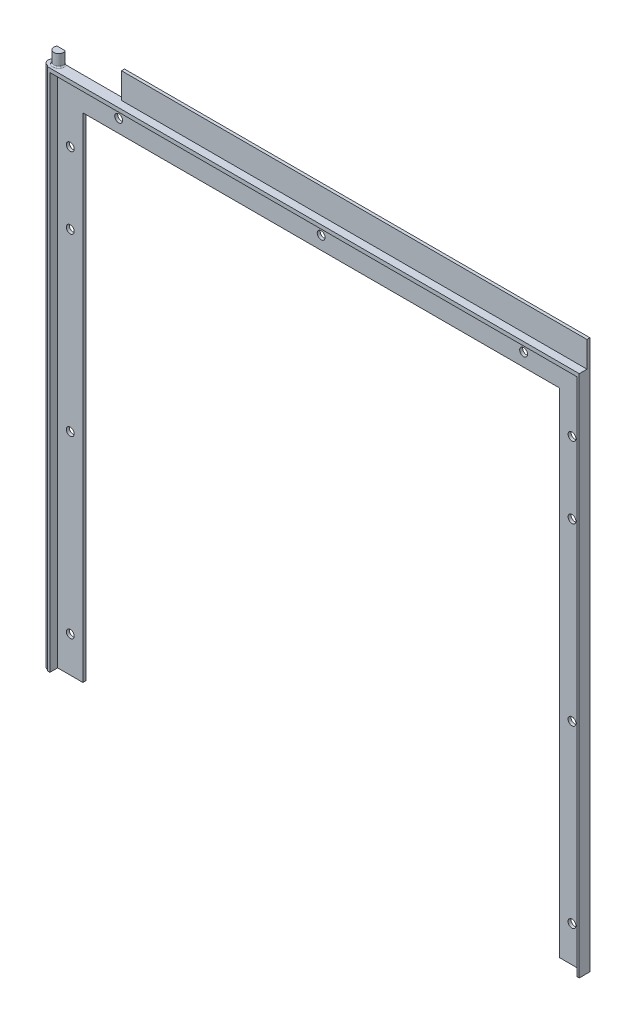
ISO-10303-21;
HEADER;
FILE_DESCRIPTION(('STEP AP214'),'2;1');
FILE_NAME('part.step','',(''),(''),'','','');
FILE_SCHEMA(('AUTOMOTIVE_DESIGN { 1 0 10303 214 1 1 1 1 }'));
ENDSEC;
DATA;
#1=APPLICATION_CONTEXT('core data for automotive mechanical design processes');
#2=APPLICATION_PROTOCOL_DEFINITION('international standard','automotive_design',2000,#1);
#3=PRODUCT_CONTEXT('',#1,'mechanical');
#4=PRODUCT('Part','Part','',(#3));
#5=PRODUCT_RELATED_PRODUCT_CATEGORY('part','',(#4));
#6=PRODUCT_DEFINITION_FORMATION('','',#4);
#7=PRODUCT_DEFINITION_CONTEXT('part definition',#1,'design');
#8=PRODUCT_DEFINITION('design','',#6,#7);
#9=PRODUCT_DEFINITION_SHAPE('','',#8);
#10=(LENGTH_UNIT() NAMED_UNIT(*) SI_UNIT(.MILLI.,.METRE.));
#11=(NAMED_UNIT(*) PLANE_ANGLE_UNIT() SI_UNIT($,.RADIAN.));
#12=(NAMED_UNIT(*) SI_UNIT($,.STERADIAN.) SOLID_ANGLE_UNIT());
#13=UNCERTAINTY_MEASURE_WITH_UNIT(LENGTH_MEASURE(1.E-05),#10,'distance_accuracy_value','');
#14=(GEOMETRIC_REPRESENTATION_CONTEXT(3) GLOBAL_UNCERTAINTY_ASSIGNED_CONTEXT((#13)) GLOBAL_UNIT_ASSIGNED_CONTEXT((#10,
#11,#12)) REPRESENTATION_CONTEXT('',''));
#15=CARTESIAN_POINT('',(0.,0.,0.));
#16=DIRECTION('',(0.,0.,1.));
#17=DIRECTION('',(1.,0.,0.));
#18=AXIS2_PLACEMENT_3D('',#15,#16,#17);
#19=CARTESIAN_POINT('',(92.3497974872589,279.450982809067,1.25));
#20=DIRECTION('',(0.,-1.,0.));
#21=DIRECTION('',(0.,0.,-1.));
#22=AXIS2_PLACEMENT_3D('',#19,#20,#21);
#23=PLANE('',#22);
#24=DIRECTION('',(-1.,0.,0.));
#25=VECTOR('',#24,1.);
#26=CARTESIAN_POINT('',(92.3497974872589,279.450982809067,0.));
#27=LINE('',#26,#25);
#28=CARTESIAN_POINT('',(92.3497974872589,279.450982809067,0.));
#29=VERTEX_POINT('',#28);
#30=CARTESIAN_POINT('',(68.0337396467907,279.450982809067,0.));
#31=VERTEX_POINT('',#30);
#32=EDGE_CURVE('E303',#29,#31,#27,.T.);
#33=ORIENTED_EDGE('',*,*,#32,.T.);
#34=CARTESIAN_POINT('',(65.7508447313991,279.450982809067,1.01901462466386));
#35=DIRECTION('',(0.,-1.,0.));
#36=DIRECTION('',(0.,0.,-1.));
#37=AXIS2_PLACEMENT_3D('',#34,#35,#36);
#38=CIRCLE('',#37,2.49999999999999);
#39=CARTESIAN_POINT('',(63.3919678208426,279.450982809067,0.190944747875881));
#40=VERTEX_POINT('',#39);
#41=EDGE_CURVE('E385',#31,#40,#38,.T.);
#42=ORIENTED_EDGE('',*,*,#41,.T.);
#43=CARTESIAN_POINT('',(64.2486485862909,279.450982809067,1.99631338144911));
#44=DIRECTION('',(0.,1.,0.));
#45=DIRECTION('',(0.,0.,1.));
#46=AXIS2_PLACEMENT_3D('',#43,#44,#45);
#47=CIRCLE('',#46,1.99831374838364);
#48=CARTESIAN_POINT('',(64.2031414601707,279.450982809067,3.99410890112859));
#49=VERTEX_POINT('',#48);
#50=EDGE_CURVE('E205',#40,#49,#47,.T.);
#51=ORIENTED_EDGE('',*,*,#50,.T.);
#52=DIRECTION('',(0.422618261740709,0.,0.906307787036646));
#53=VECTOR('',#52,1.);
#54=CARTESIAN_POINT('',(64.2031414601707,279.450982809067,3.99410890112859));
#55=LINE('',#54,#53);
#56=CARTESIAN_POINT('',(64.4390423537669,279.450982809067,4.5));
#57=VERTEX_POINT('',#56);
#58=EDGE_CURVE('E218',#49,#57,#55,.T.);
#59=ORIENTED_EDGE('',*,*,#58,.T.);
#60=DIRECTION('',(-1.,0.,0.));
#61=VECTOR('',#60,1.);
#62=CARTESIAN_POINT('',(92.3497974872589,279.450982809067,4.5));
#63=LINE('',#62,#61);
#64=CARTESIAN_POINT('',(287.750005722046,279.450982809067,4.5));
#65=VERTEX_POINT('',#64);
#66=EDGE_CURVE('E261',#65,#57,#63,.T.);
#67=ORIENTED_EDGE('',*,*,#66,.F.);
#68=DIRECTION('',(0.,0.,-1.));
#69=VECTOR('',#68,1.);
#70=CARTESIAN_POINT('',(287.750005722046,279.450982809067,4.5));
#71=LINE('',#70,#69);
#72=CARTESIAN_POINT('',(287.750005722046,279.450982809067,1.25));
#73=VERTEX_POINT('',#72);
#74=EDGE_CURVE('E264',#65,#73,#71,.T.);
#75=ORIENTED_EDGE('',*,*,#74,.T.);
#76=DIRECTION('',(-1.,0.,0.));
#77=VECTOR('',#76,1.);
#78=CARTESIAN_POINT('',(92.3497974872589,279.450982809067,1.25));
#79=LINE('',#78,#77);
#80=CARTESIAN_POINT('',(92.3497974872589,279.450982809067,1.25));
#81=VERTEX_POINT('',#80);
#82=EDGE_CURVE('E245',#73,#81,#79,.T.);
#83=ORIENTED_EDGE('',*,*,#82,.T.);
#84=DIRECTION('',(0.,0.,-1.));
#85=VECTOR('',#84,1.);
#86=CARTESIAN_POINT('',(92.3497974872589,279.450982809067,1.25));
#87=LINE('',#86,#85);
#88=EDGE_CURVE('E324',#81,#29,#87,.T.);
#89=ORIENTED_EDGE('',*,*,#88,.T.);
#90=EDGE_LOOP('',(#33,#42,#51,#59,#67,#75,#83,#89));
#91=FACE_BOUND('',#90,.T.);
#92=ADVANCED_FACE('F43',(#91),#23,.F.);
#93=CARTESIAN_POINT('',(0.,0.,1.25));
#94=DIRECTION('',(0.,0.,1.));
#95=DIRECTION('',(1.,0.,0.));
#96=AXIS2_PLACEMENT_3D('',#93,#94,#95);
#97=PLANE('',#96);
#98=ORIENTED_EDGE('',*,*,#82,.F.);
#99=DIRECTION('',(0.,1.,0.));
#100=VECTOR('',#99,1.);
#101=CARTESIAN_POINT('',(287.750005722046,59.7510002553463,1.25));
#102=LINE('',#101,#100);
#103=CARTESIAN_POINT('',(287.750005722046,290.251016616821,1.25));
#104=VERTEX_POINT('',#103);
#105=EDGE_CURVE('E315',#73,#104,#102,.T.);
#106=ORIENTED_EDGE('',*,*,#105,.T.);
#107=DIRECTION('',(-1.,0.,0.));
#108=VECTOR('',#107,1.);
#109=CARTESIAN_POINT('',(287.750005722046,290.251016616821,1.25));
#110=LINE('',#109,#108);
#111=CARTESIAN_POINT('',(92.3497974872589,290.251016616821,1.25));
#112=VERTEX_POINT('',#111);
#113=EDGE_CURVE('E318',#104,#112,#110,.T.);
#114=ORIENTED_EDGE('',*,*,#113,.T.);
#115=DIRECTION('',(0.,-1.,0.));
#116=VECTOR('',#115,1.);
#117=CARTESIAN_POINT('',(92.3497974872589,290.251016616821,1.25));
#118=LINE('',#117,#116);
#119=EDGE_CURVE('E321',#112,#81,#118,.T.);
#120=ORIENTED_EDGE('',*,*,#119,.T.);
#121=EDGE_LOOP('',(#98,#106,#114,#120));
#122=FACE_BOUND('',#121,.T.);
#123=ADVANCED_FACE('F410',(#122),#97,.T.);
#124=CARTESIAN_POINT('',(64.4390423537669,59.7510002553463,1.25));
#125=DIRECTION('',(0.,1.,0.));
#126=DIRECTION('',(0.,0.,1.));
#127=AXIS2_PLACEMENT_3D('',#124,#125,#126);
#128=PLANE('',#127);
#129=DIRECTION('',(0.,0.,-1.));
#130=VECTOR('',#129,1.);
#131=CARTESIAN_POINT('',(65.5498809996054,59.7510002553463,4.5));
#132=LINE('',#131,#130);
#133=CARTESIAN_POINT('',(65.5498809996054,59.7510002553463,4.5));
#134=VERTEX_POINT('',#133);
#135=CARTESIAN_POINT('',(65.5498809996054,59.7510002553463,1.25));
#136=VERTEX_POINT('',#135);
#137=EDGE_CURVE('E294',#134,#136,#132,.T.);
#138=ORIENTED_EDGE('',*,*,#137,.F.);
#139=DIRECTION('',(1.,0.,0.));
#140=VECTOR('',#139,1.);
#141=CARTESIAN_POINT('',(65.5498809996054,59.7510002553463,4.5));
#142=LINE('',#141,#140);
#143=CARTESIAN_POINT('',(64.4390423537669,59.7510002553463,4.5));
#144=VERTEX_POINT('',#143);
#145=EDGE_CURVE('E241',#144,#134,#142,.T.);
#146=ORIENTED_EDGE('',*,*,#145,.F.);
#147=DIRECTION('',(0.422618261740709,0.,0.906307787036646));
#148=VECTOR('',#147,1.);
#149=CARTESIAN_POINT('',(64.2031414601707,59.7510002553463,3.99410890112859));
#150=LINE('',#149,#148);
#151=CARTESIAN_POINT('',(64.2031414601707,59.7510002553463,3.99410890112859));
#152=VERTEX_POINT('',#151);
#153=EDGE_CURVE('E226',#152,#144,#150,.T.);
#154=ORIENTED_EDGE('',*,*,#153,.F.);
#155=CARTESIAN_POINT('',(64.2486485862909,59.7510002553463,1.99631338144911));
#156=DIRECTION('',(0.,-1.,0.));
#157=DIRECTION('',(0.,0.,-1.));
#158=AXIS2_PLACEMENT_3D('',#155,#156,#157);
#159=CIRCLE('',#158,1.99831374838364);
#160=CARTESIAN_POINT('',(64.1592577588739,59.7510002553463,0.));
#161=VERTEX_POINT('',#160);
#162=EDGE_CURVE('E236',#161,#152,#159,.F.);
#163=ORIENTED_EDGE('',*,*,#162,.F.);
#164=DIRECTION('',(1.,0.,0.));
#165=VECTOR('',#164,1.);
#166=CARTESIAN_POINT('',(64.4390423537669,59.7510002553463,0.));
#167=LINE('',#166,#165);
#168=CARTESIAN_POINT('',(76.1518031358719,59.7510002553463,0.));
#169=VERTEX_POINT('',#168);
#170=EDGE_CURVE('E298',#161,#169,#167,.T.);
#171=ORIENTED_EDGE('',*,*,#170,.T.);
#172=DIRECTION('',(0.,0.,-1.));
#173=VECTOR('',#172,1.);
#174=CARTESIAN_POINT('',(76.1518031358719,59.7510002553463,1.25));
#175=LINE('',#174,#173);
#176=CARTESIAN_POINT('',(76.1518031358719,59.7510002553463,1.25));
#177=VERTEX_POINT('',#176);
#178=EDGE_CURVE('E377',#177,#169,#175,.T.);
#179=ORIENTED_EDGE('',*,*,#178,.F.);
#180=DIRECTION('',(1.,0.,0.));
#181=VECTOR('',#180,1.);
#182=CARTESIAN_POINT('',(64.4390423537669,59.7510002553463,1.25));
#183=LINE('',#182,#181);
#184=EDGE_CURVE('E299',#136,#177,#183,.T.);
#185=ORIENTED_EDGE('',*,*,#184,.F.);
#186=EDGE_LOOP('',(#138,#146,#154,#163,#171,#179,#185));
#187=FACE_BOUND('',#186,.T.);
#188=ADVANCED_FACE('F438',(#187),#128,.F.);
#189=CARTESIAN_POINT('',(76.1518031358719,59.7510002553463,1.25));
#190=DIRECTION('',(-1.,0.,0.));
#191=DIRECTION('',(0.,0.,1.));
#192=AXIS2_PLACEMENT_3D('',#189,#190,#191);
#193=PLANE('',#192);
#194=DIRECTION('',(0.,1.,0.));
#195=VECTOR('',#194,1.);
#196=CARTESIAN_POINT('',(76.1518031358719,59.7510002553463,0.));
#197=LINE('',#196,#195);
#198=CARTESIAN_POINT('',(76.1518031358719,266.850888729095,0.));
#199=VERTEX_POINT('',#198);
#200=EDGE_CURVE('E327',#169,#199,#197,.T.);
#201=ORIENTED_EDGE('',*,*,#200,.T.);
#202=DIRECTION('',(0.,0.,-1.));
#203=VECTOR('',#202,1.);
#204=CARTESIAN_POINT('',(76.1518031358719,266.850888729095,1.25));
#205=LINE('',#204,#203);
#206=CARTESIAN_POINT('',(76.1518031358719,266.850888729095,1.25));
#207=VERTEX_POINT('',#206);
#208=EDGE_CURVE('E373',#207,#199,#205,.T.);
#209=ORIENTED_EDGE('',*,*,#208,.F.);
#210=DIRECTION('',(0.,1.,0.));
#211=VECTOR('',#210,1.);
#212=CARTESIAN_POINT('',(76.1518031358719,59.7510002553463,1.25));
#213=LINE('',#212,#211);
#214=EDGE_CURVE('E302',#177,#207,#213,.T.);
#215=ORIENTED_EDGE('',*,*,#214,.F.);
#216=ORIENTED_EDGE('',*,*,#178,.T.);
#217=EDGE_LOOP('',(#201,#209,#215,#216));
#218=FACE_BOUND('',#217,.T.);
#219=ADVANCED_FACE('F435',(#218),#193,.F.);
#220=CARTESIAN_POINT('',(76.1518031358719,266.850888729095,1.25));
#221=DIRECTION('',(0.,1.,0.));
#222=DIRECTION('',(0.,0.,1.));
#223=AXIS2_PLACEMENT_3D('',#220,#221,#222);
#224=PLANE('',#223);
#225=DIRECTION('',(1.,0.,0.));
#226=VECTOR('',#225,1.);
#227=CARTESIAN_POINT('',(76.1518031358719,266.850888729095,0.));
#228=LINE('',#227,#226);
#229=CARTESIAN_POINT('',(276.149988174438,266.850888729095,0.));
#230=VERTEX_POINT('',#229);
#231=EDGE_CURVE('E330',#199,#230,#228,.T.);
#232=ORIENTED_EDGE('',*,*,#231,.T.);
#233=DIRECTION('',(0.,0.,-1.));
#234=VECTOR('',#233,1.);
#235=CARTESIAN_POINT('',(276.149988174438,266.850888729095,1.25));
#236=LINE('',#235,#234);
#237=CARTESIAN_POINT('',(276.149988174438,266.850888729095,1.25));
#238=VERTEX_POINT('',#237);
#239=EDGE_CURVE('E369',#238,#230,#236,.T.);
#240=ORIENTED_EDGE('',*,*,#239,.F.);
#241=DIRECTION('',(1.,0.,0.));
#242=VECTOR('',#241,1.);
#243=CARTESIAN_POINT('',(76.1518031358719,266.850888729095,1.25));
#244=LINE('',#243,#242);
#245=EDGE_CURVE('E306',#207,#238,#244,.T.);
#246=ORIENTED_EDGE('',*,*,#245,.F.);
#247=ORIENTED_EDGE('',*,*,#208,.T.);
#248=EDGE_LOOP('',(#232,#240,#246,#247));
#249=FACE_BOUND('',#248,.T.);
#250=ADVANCED_FACE('F431',(#249),#224,.F.);
#251=CARTESIAN_POINT('',(276.149988174438,266.850888729095,1.25));
#252=DIRECTION('',(1.,0.,0.));
#253=DIRECTION('',(0.,0.,-1.));
#254=AXIS2_PLACEMENT_3D('',#251,#252,#253);
#255=PLANE('',#254);
#256=DIRECTION('',(0.,-1.,0.));
#257=VECTOR('',#256,1.);
#258=CARTESIAN_POINT('',(276.149988174438,266.850888729095,0.));
#259=LINE('',#258,#257);
#260=CARTESIAN_POINT('',(276.149988174438,59.7510002553463,0.));
#261=VERTEX_POINT('',#260);
#262=EDGE_CURVE('E333',#230,#261,#259,.T.);
#263=ORIENTED_EDGE('',*,*,#262,.T.);
#264=DIRECTION('',(0.,0.,-1.));
#265=VECTOR('',#264,1.);
#266=CARTESIAN_POINT('',(276.149988174438,59.7510002553463,1.25));
#267=LINE('',#266,#265);
#268=CARTESIAN_POINT('',(276.149988174438,59.7510002553463,1.25));
#269=VERTEX_POINT('',#268);
#270=EDGE_CURVE('E365',#269,#261,#267,.T.);
#271=ORIENTED_EDGE('',*,*,#270,.F.);
#272=DIRECTION('',(0.,-1.,0.));
#273=VECTOR('',#272,1.);
#274=CARTESIAN_POINT('',(276.149988174438,266.850888729095,1.25));
#275=LINE('',#274,#273);
#276=EDGE_CURVE('E309',#238,#269,#275,.T.);
#277=ORIENTED_EDGE('',*,*,#276,.F.);
#278=ORIENTED_EDGE('',*,*,#239,.T.);
#279=EDGE_LOOP('',(#263,#271,#277,#278));
#280=FACE_BOUND('',#279,.T.);
#281=ADVANCED_FACE('F427',(#280),#255,.F.);
#282=CARTESIAN_POINT('',(276.149988174438,59.7510002553463,1.25));
#283=DIRECTION('',(0.,1.,0.));
#284=DIRECTION('',(0.,0.,1.));
#285=AXIS2_PLACEMENT_3D('',#282,#283,#284);
#286=PLANE('',#285);
#287=DIRECTION('',(1.,0.,0.));
#288=VECTOR('',#287,1.);
#289=CARTESIAN_POINT('',(276.149988174438,59.7510002553463,0.));
#290=LINE('',#289,#288);
#291=CARTESIAN_POINT('',(287.750005722046,59.7510002553463,0.));
#292=VERTEX_POINT('',#291);
#293=EDGE_CURVE('E336',#261,#292,#290,.T.);
#294=ORIENTED_EDGE('',*,*,#293,.T.);
#295=DIRECTION('',(0.,0.,-1.));
#296=VECTOR('',#295,1.);
#297=CARTESIAN_POINT('',(287.750005722046,59.7510002553463,1.25));
#298=LINE('',#297,#296);
#299=CARTESIAN_POINT('',(287.750005722046,59.7510002553463,4.5));
#300=VERTEX_POINT('',#299);
#301=EDGE_CURVE('E361',#300,#292,#298,.T.);
#302=ORIENTED_EDGE('',*,*,#301,.F.);
#303=DIRECTION('',(1.,0.,0.));
#304=VECTOR('',#303,1.);
#305=CARTESIAN_POINT('',(287.750005722046,59.7510002553463,4.5));
#306=LINE('',#305,#304);
#307=CARTESIAN_POINT('',(286.751151674577,59.7510002553463,4.5));
#308=VERTEX_POINT('',#307);
#309=EDGE_CURVE('E254',#308,#300,#306,.T.);
#310=ORIENTED_EDGE('',*,*,#309,.F.);
#311=DIRECTION('',(0.,0.,-1.));
#312=VECTOR('',#311,1.);
#313=CARTESIAN_POINT('',(286.751151674577,59.7510002553463,4.5));
#314=LINE('',#313,#312);
#315=CARTESIAN_POINT('',(286.751151674577,59.7510002553463,1.25));
#316=VERTEX_POINT('',#315);
#317=EDGE_CURVE('E282',#308,#316,#314,.T.);
#318=ORIENTED_EDGE('',*,*,#317,.T.);
#319=DIRECTION('',(1.,0.,0.));
#320=VECTOR('',#319,1.);
#321=CARTESIAN_POINT('',(276.149988174438,59.7510002553463,1.25));
#322=LINE('',#321,#320);
#323=EDGE_CURVE('E312',#269,#316,#322,.T.);
#324=ORIENTED_EDGE('',*,*,#323,.F.);
#325=ORIENTED_EDGE('',*,*,#270,.T.);
#326=EDGE_LOOP('',(#294,#302,#310,#318,#324,#325));
#327=FACE_BOUND('',#326,.T.);
#328=ADVANCED_FACE('F423',(#327),#286,.F.);
#329=CARTESIAN_POINT('',(287.750005722046,59.7510002553463,1.25));
#330=DIRECTION('',(-1.,0.,0.));
#331=DIRECTION('',(0.,0.,1.));
#332=AXIS2_PLACEMENT_3D('',#329,#330,#331);
#333=PLANE('',#332);
#334=DIRECTION('',(0.,1.,0.));
#335=VECTOR('',#334,1.);
#336=CARTESIAN_POINT('',(287.750005722046,59.7510002553463,0.));
#337=LINE('',#336,#335);
#338=CARTESIAN_POINT('',(287.750005722046,290.251016616821,0.));
#339=VERTEX_POINT('',#338);
#340=EDGE_CURVE('E339',#292,#339,#337,.T.);
#341=ORIENTED_EDGE('',*,*,#340,.T.);
#342=DIRECTION('',(0.,0.,-1.));
#343=VECTOR('',#342,1.);
#344=CARTESIAN_POINT('',(287.750005722046,290.251016616821,1.25));
#345=LINE('',#344,#343);
#346=EDGE_CURVE('E357',#104,#339,#345,.T.);
#347=ORIENTED_EDGE('',*,*,#346,.F.);
#348=ORIENTED_EDGE('',*,*,#105,.F.);
#349=ORIENTED_EDGE('',*,*,#74,.F.);
#350=DIRECTION('',(0.,1.,0.));
#351=VECTOR('',#350,1.);
#352=CARTESIAN_POINT('',(287.750005722046,59.7510002553463,4.5));
#353=LINE('',#352,#351);
#354=EDGE_CURVE('E258',#300,#65,#353,.T.);
#355=ORIENTED_EDGE('',*,*,#354,.F.);
#356=ORIENTED_EDGE('',*,*,#301,.T.);
#357=EDGE_LOOP('',(#341,#347,#348,#349,#355,#356));
#358=FACE_BOUND('',#357,.T.);
#359=ADVANCED_FACE('F419',(#358),#333,.F.);
#360=CARTESIAN_POINT('',(287.750005722046,290.251016616821,1.25));
#361=DIRECTION('',(0.,-1.,0.));
#362=DIRECTION('',(0.,0.,-1.));
#363=AXIS2_PLACEMENT_3D('',#360,#361,#362);
#364=PLANE('',#363);
#365=DIRECTION('',(-1.,0.,0.));
#366=VECTOR('',#365,1.);
#367=CARTESIAN_POINT('',(287.750005722046,290.251016616821,0.));
#368=LINE('',#367,#366);
#369=CARTESIAN_POINT('',(92.3497974872589,290.251016616821,0.));
#370=VERTEX_POINT('',#369);
#371=EDGE_CURVE('E342',#339,#370,#368,.T.);
#372=ORIENTED_EDGE('',*,*,#371,.T.);
#373=DIRECTION('',(0.,0.,-1.));
#374=VECTOR('',#373,1.);
#375=CARTESIAN_POINT('',(92.3497974872589,290.251016616821,1.25));
#376=LINE('',#375,#374);
#377=EDGE_CURVE('E353',#112,#370,#376,.T.);
#378=ORIENTED_EDGE('',*,*,#377,.F.);
#379=ORIENTED_EDGE('',*,*,#113,.F.);
#380=ORIENTED_EDGE('',*,*,#346,.T.);
#381=EDGE_LOOP('',(#372,#378,#379,#380));
#382=FACE_BOUND('',#381,.T.);
#383=ADVANCED_FACE('F415',(#382),#364,.F.);
#384=CARTESIAN_POINT('',(92.3497974872589,290.251016616821,1.25));
#385=DIRECTION('',(1.,0.,0.));
#386=DIRECTION('',(0.,0.,-1.));
#387=AXIS2_PLACEMENT_3D('',#384,#385,#386);
#388=PLANE('',#387);
#389=DIRECTION('',(0.,-1.,0.));
#390=VECTOR('',#389,1.);
#391=CARTESIAN_POINT('',(92.3497974872589,290.251016616821,0.));
#392=LINE('',#391,#390);
#393=EDGE_CURVE('E345',#370,#29,#392,.T.);
#394=ORIENTED_EDGE('',*,*,#393,.T.);
#395=ORIENTED_EDGE('',*,*,#88,.F.);
#396=ORIENTED_EDGE('',*,*,#119,.F.);
#397=ORIENTED_EDGE('',*,*,#377,.T.);
#398=EDGE_LOOP('',(#394,#395,#396,#397));
#399=FACE_BOUND('',#398,.T.);
#400=ADVANCED_FACE('F412',(#399),#388,.F.);
#401=CARTESIAN_POINT('',(91.1518031358719,272.342426260702,1.25));
#402=DIRECTION('',(0.,0.,1.));
#403=DIRECTION('',(1.,0.,0.));
#404=AXIS2_PLACEMENT_3D('',#401,#402,#403);
#405=CIRCLE('',#404,1.65000000000002);
#406=CARTESIAN_POINT('',(92.8018031358719,272.342426260702,1.25));
#407=VERTEX_POINT('',#406);
#408=EDGE_CURVE('E728',#407,#407,#405,.T.);
#409=ORIENTED_EDGE('',*,*,#408,.F.);
#410=EDGE_LOOP('',(#409));
#411=FACE_BOUND('',#410,.T.);
#412=CARTESIAN_POINT('',(70.8508420677386,148.300944492221,1.25));
#413=DIRECTION('',(0.,0.,1.));
#414=DIRECTION('',(1.,0.,0.));
#415=AXIS2_PLACEMENT_3D('',#412,#413,#414);
#416=CIRCLE('',#415,1.65000000000002);
#417=CARTESIAN_POINT('',(72.5008420677387,148.300944492221,1.25));
#418=VERTEX_POINT('',#417);
#419=EDGE_CURVE('E794',#418,#418,#416,.T.);
#420=ORIENTED_EDGE('',*,*,#419,.F.);
#421=EDGE_LOOP('',(#420));
#422=FACE_BOUND('',#421,.T.);
#423=CARTESIAN_POINT('',(70.8508420677386,221.850888729095,1.25));
#424=DIRECTION('',(0.,0.,1.));
#425=DIRECTION('',(1.,0.,0.));
#426=AXIS2_PLACEMENT_3D('',#423,#424,#425);
#427=CIRCLE('',#426,1.65000000000002);
#428=CARTESIAN_POINT('',(72.5008420677387,221.850888729095,1.25));
#429=VERTEX_POINT('',#428);
#430=EDGE_CURVE('E785',#429,#429,#427,.T.);
#431=ORIENTED_EDGE('',*,*,#430,.F.);
#432=EDGE_LOOP('',(#431));
#433=FACE_BOUND('',#432,.T.);
#434=CARTESIAN_POINT('',(70.8508420677386,74.7510002553463,1.25));
#435=DIRECTION('',(0.,0.,1.));
#436=DIRECTION('',(1.,0.,0.));
#437=AXIS2_PLACEMENT_3D('',#434,#435,#436);
#438=CIRCLE('',#437,1.65);
#439=CARTESIAN_POINT('',(72.5008420677386,74.7510002553463,1.25));
#440=VERTEX_POINT('',#439);
#441=EDGE_CURVE('E781',#440,#440,#438,.T.);
#442=ORIENTED_EDGE('',*,*,#441,.F.);
#443=EDGE_LOOP('',(#442));
#444=FACE_BOUND('',#443,.T.);
#445=CARTESIAN_POINT('',(176.149949567158,272.342426260702,1.25));
#446=DIRECTION('',(0.,0.,1.));
#447=DIRECTION('',(1.,0.,0.));
#448=AXIS2_PLACEMENT_3D('',#445,#446,#447);
#449=CIRCLE('',#448,1.65000000000002);
#450=CARTESIAN_POINT('',(177.799949567158,272.342426260702,1.25));
#451=VERTEX_POINT('',#450);
#452=EDGE_CURVE('E812',#451,#451,#449,.T.);
#453=ORIENTED_EDGE('',*,*,#452,.F.);
#454=EDGE_LOOP('',(#453));
#455=FACE_BOUND('',#454,.T.);
#456=CARTESIAN_POINT('',(261.148095998443,272.342426260702,1.25));
#457=DIRECTION('',(0.,0.,1.));
#458=DIRECTION('',(-1.,0.,0.));
#459=AXIS2_PLACEMENT_3D('',#456,#457,#458);
#460=CIRCLE('',#459,1.64999999999999);
#461=CARTESIAN_POINT('',(259.498095998443,272.342426260702,1.25));
#462=VERTEX_POINT('',#461);
#463=EDGE_CURVE('E817',#462,#462,#460,.T.);
#464=ORIENTED_EDGE('',*,*,#463,.F.);
#465=EDGE_LOOP('',(#464));
#466=FACE_BOUND('',#465,.T.);
#467=CARTESIAN_POINT('',(281.449057066577,251.850888729095,1.25));
#468=DIRECTION('',(0.,0.,1.));
#469=DIRECTION('',(-1.,0.,0.));
#470=AXIS2_PLACEMENT_3D('',#467,#468,#469);
#471=CIRCLE('',#470,1.64999999999999);
#472=CARTESIAN_POINT('',(279.799057066577,251.850888729095,1.25));
#473=VERTEX_POINT('',#472);
#474=EDGE_CURVE('E804',#473,#473,#471,.T.);
#475=ORIENTED_EDGE('',*,*,#474,.F.);
#476=EDGE_LOOP('',(#475));
#477=FACE_BOUND('',#476,.T.);
#478=CARTESIAN_POINT('',(281.449057066577,221.850888729095,1.25));
#479=DIRECTION('',(0.,0.,1.));
#480=DIRECTION('',(-1.,0.,0.));
#481=AXIS2_PLACEMENT_3D('',#478,#479,#480);
#482=CIRCLE('',#481,1.64999999999998);
#483=CARTESIAN_POINT('',(279.799057066577,221.850888729095,1.25));
#484=VERTEX_POINT('',#483);
#485=EDGE_CURVE('E788',#484,#484,#482,.T.);
#486=ORIENTED_EDGE('',*,*,#485,.F.);
#487=EDGE_LOOP('',(#486));
#488=FACE_BOUND('',#487,.T.);
#489=CARTESIAN_POINT('',(281.449057066577,148.300944492221,1.25));
#490=DIRECTION('',(0.,0.,1.));
#491=DIRECTION('',(-1.,0.,0.));
#492=AXIS2_PLACEMENT_3D('',#489,#490,#491);
#493=CIRCLE('',#492,1.64999999999998);
#494=CARTESIAN_POINT('',(279.799057066577,148.300944492221,1.25));
#495=VERTEX_POINT('',#494);
#496=EDGE_CURVE('E797',#495,#495,#493,.T.);
#497=ORIENTED_EDGE('',*,*,#496,.F.);
#498=EDGE_LOOP('',(#497));
#499=FACE_BOUND('',#498,.T.);
#500=CARTESIAN_POINT('',(281.449057066577,74.7510002553463,1.25));
#501=DIRECTION('',(0.,0.,1.));
#502=DIRECTION('',(-1.,0.,0.));
#503=AXIS2_PLACEMENT_3D('',#500,#501,#502);
#504=CIRCLE('',#503,1.64999999999999);
#505=CARTESIAN_POINT('',(279.799057066577,74.7510002553463,1.25));
#506=VERTEX_POINT('',#505);
#507=EDGE_CURVE('E799',#506,#506,#504,.T.);
#508=ORIENTED_EDGE('',*,*,#507,.F.);
#509=EDGE_LOOP('',(#508));
#510=FACE_BOUND('',#509,.T.);
#511=CARTESIAN_POINT('',(70.8508420677386,251.850888729095,1.25));
#512=DIRECTION('',(0.,0.,1.));
#513=DIRECTION('',(1.,0.,0.));
#514=AXIS2_PLACEMENT_3D('',#511,#512,#513);
#515=CIRCLE('',#514,1.65000000000002);
#516=CARTESIAN_POINT('',(72.5008420677386,251.850888729095,1.25));
#517=VERTEX_POINT('',#516);
#518=EDGE_CURVE('E777',#517,#517,#515,.T.);
#519=ORIENTED_EDGE('',*,*,#518,.F.);
#520=EDGE_LOOP('',(#519));
#521=FACE_BOUND('',#520,.T.);
#522=DIRECTION('',(5.33201121225554E-06,-0.999999999985785,0.));
#523=VECTOR('',#522,1.);
#524=CARTESIAN_POINT('',(286.751151674577,59.7510002553463,1.25));
#525=LINE('',#524,#523);
#526=CARTESIAN_POINT('',(286.749988794327,277.845112205294,1.25));
#527=VERTEX_POINT('',#526);
#528=EDGE_CURVE('E272',#527,#316,#525,.T.);
#529=ORIENTED_EDGE('',*,*,#528,.F.);
#530=DIRECTION('',(0.999999998598843,5.29368899106635E-05,0.));
#531=VECTOR('',#530,1.);
#532=CARTESIAN_POINT('',(65.5498809996054,277.833402559523,1.25));
#533=LINE('',#532,#531);
#534=CARTESIAN_POINT('',(65.5498809996054,277.833402559523,1.25));
#535=VERTEX_POINT('',#534);
#536=EDGE_CURVE('E268',#535,#527,#533,.T.);
#537=ORIENTED_EDGE('',*,*,#536,.F.);
#538=DIRECTION('',(0.,1.,0.));
#539=VECTOR('',#538,1.);
#540=CARTESIAN_POINT('',(65.5498809996054,59.7510002553463,1.25));
#541=LINE('',#540,#539);
#542=EDGE_CURVE('E240',#136,#535,#541,.T.);
#543=ORIENTED_EDGE('',*,*,#542,.F.);
#544=ORIENTED_EDGE('',*,*,#184,.T.);
#545=ORIENTED_EDGE('',*,*,#214,.T.);
#546=ORIENTED_EDGE('',*,*,#245,.T.);
#547=ORIENTED_EDGE('',*,*,#276,.T.);
#548=ORIENTED_EDGE('',*,*,#323,.T.);
#549=EDGE_LOOP('',(#529,#537,#543,#544,#545,#546,#547,#548));
#550=FACE_BOUND('',#549,.T.);
#551=ADVANCED_FACE('F405',(#411,#422,#433,#444,#455,#466,#477,#488,#499,#510,#521,#550),#97,.T.);
#552=CARTESIAN_POINT('',(0.,0.,0.));
#553=DIRECTION('',(0.,0.,1.));
#554=DIRECTION('',(1.,0.,0.));
#555=AXIS2_PLACEMENT_3D('',#552,#553,#554);
#556=PLANE('',#555);
#557=CARTESIAN_POINT('',(91.1518031358719,272.342426260702,0.));
#558=DIRECTION('',(0.,0.,1.));
#559=DIRECTION('',(1.,0.,0.));
#560=AXIS2_PLACEMENT_3D('',#557,#558,#559);
#561=CIRCLE('',#560,1.65000000000002);
#562=CARTESIAN_POINT('',(92.8018031358719,272.342426260702,0.));
#563=VERTEX_POINT('',#562);
#564=EDGE_CURVE('E48',#563,#563,#561,.T.);
#565=ORIENTED_EDGE('',*,*,#564,.T.);
#566=EDGE_LOOP('',(#565));
#567=FACE_BOUND('',#566,.T.);
#568=CARTESIAN_POINT('',(70.8508420677386,148.300944492221,0.));
#569=DIRECTION('',(0.,0.,1.));
#570=DIRECTION('',(1.,0.,0.));
#571=AXIS2_PLACEMENT_3D('',#568,#569,#570);
#572=CIRCLE('',#571,1.65000000000002);
#573=CARTESIAN_POINT('',(72.5008420677387,148.300944492221,0.));
#574=VERTEX_POINT('',#573);
#575=EDGE_CURVE('E733',#574,#574,#572,.T.);
#576=ORIENTED_EDGE('',*,*,#575,.T.);
#577=EDGE_LOOP('',(#576));
#578=FACE_BOUND('',#577,.T.);
#579=CARTESIAN_POINT('',(70.8508420677386,221.850888729095,0.));
#580=DIRECTION('',(0.,0.,1.));
#581=DIRECTION('',(1.,0.,0.));
#582=AXIS2_PLACEMENT_3D('',#579,#580,#581);
#583=CIRCLE('',#582,1.65000000000002);
#584=CARTESIAN_POINT('',(72.5008420677387,221.850888729095,0.));
#585=VERTEX_POINT('',#584);
#586=EDGE_CURVE('E739',#585,#585,#583,.T.);
#587=ORIENTED_EDGE('',*,*,#586,.T.);
#588=EDGE_LOOP('',(#587));
#589=FACE_BOUND('',#588,.T.);
#590=CARTESIAN_POINT('',(70.8508420677386,74.7510002553463,0.));
#591=DIRECTION('',(0.,0.,1.));
#592=DIRECTION('',(1.,0.,0.));
#593=AXIS2_PLACEMENT_3D('',#590,#591,#592);
#594=CIRCLE('',#593,1.65);
#595=CARTESIAN_POINT('',(72.5008420677386,74.7510002553463,0.));
#596=VERTEX_POINT('',#595);
#597=EDGE_CURVE('E745',#596,#596,#594,.T.);
#598=ORIENTED_EDGE('',*,*,#597,.T.);
#599=EDGE_LOOP('',(#598));
#600=FACE_BOUND('',#599,.T.);
#601=CARTESIAN_POINT('',(176.149949567158,272.342426260702,0.));
#602=DIRECTION('',(0.,0.,1.));
#603=DIRECTION('',(1.,0.,0.));
#604=AXIS2_PLACEMENT_3D('',#601,#602,#603);
#605=CIRCLE('',#604,1.65000000000002);
#606=CARTESIAN_POINT('',(177.799949567158,272.342426260702,0.));
#607=VERTEX_POINT('',#606);
#608=EDGE_CURVE('E751',#607,#607,#605,.T.);
#609=ORIENTED_EDGE('',*,*,#608,.T.);
#610=EDGE_LOOP('',(#609));
#611=FACE_BOUND('',#610,.T.);
#612=CARTESIAN_POINT('',(261.148095998443,272.342426260702,0.));
#613=DIRECTION('',(0.,0.,1.));
#614=DIRECTION('',(1.,0.,0.));
#615=AXIS2_PLACEMENT_3D('',#612,#613,#614);
#616=CIRCLE('',#615,1.64999999999999);
#617=CARTESIAN_POINT('',(262.798095998443,272.342426260702,0.));
#618=VERTEX_POINT('',#617);
#619=EDGE_CURVE('E755',#618,#618,#616,.T.);
#620=ORIENTED_EDGE('',*,*,#619,.T.);
#621=EDGE_LOOP('',(#620));
#622=FACE_BOUND('',#621,.T.);
#623=CARTESIAN_POINT('',(281.449057066577,251.850888729095,0.));
#624=DIRECTION('',(0.,0.,1.));
#625=DIRECTION('',(1.,0.,0.));
#626=AXIS2_PLACEMENT_3D('',#623,#624,#625);
#627=CIRCLE('',#626,1.64999999999999);
#628=CARTESIAN_POINT('',(283.099057066577,251.850888729095,0.));
#629=VERTEX_POINT('',#628);
#630=EDGE_CURVE('E759',#629,#629,#627,.T.);
#631=ORIENTED_EDGE('',*,*,#630,.T.);
#632=EDGE_LOOP('',(#631));
#633=FACE_BOUND('',#632,.T.);
#634=CARTESIAN_POINT('',(281.449057066577,221.850888729095,0.));
#635=DIRECTION('',(0.,0.,1.));
#636=DIRECTION('',(1.,0.,0.));
#637=AXIS2_PLACEMENT_3D('',#634,#635,#636);
#638=CIRCLE('',#637,1.64999999999998);
#639=CARTESIAN_POINT('',(283.099057066577,221.850888729095,0.));
#640=VERTEX_POINT('',#639);
#641=EDGE_CURVE('E763',#640,#640,#638,.T.);
#642=ORIENTED_EDGE('',*,*,#641,.T.);
#643=EDGE_LOOP('',(#642));
#644=FACE_BOUND('',#643,.T.);
#645=CARTESIAN_POINT('',(281.449057066577,148.300944492221,0.));
#646=DIRECTION('',(0.,0.,1.));
#647=DIRECTION('',(1.,0.,0.));
#648=AXIS2_PLACEMENT_3D('',#645,#646,#647);
#649=CIRCLE('',#648,1.64999999999998);
#650=CARTESIAN_POINT('',(283.099057066577,148.300944492221,0.));
#651=VERTEX_POINT('',#650);
#652=EDGE_CURVE('E767',#651,#651,#649,.T.);
#653=ORIENTED_EDGE('',*,*,#652,.T.);
#654=EDGE_LOOP('',(#653));
#655=FACE_BOUND('',#654,.T.);
#656=CARTESIAN_POINT('',(281.449057066577,74.7510002553463,0.));
#657=DIRECTION('',(0.,0.,1.));
#658=DIRECTION('',(1.,0.,0.));
#659=AXIS2_PLACEMENT_3D('',#656,#657,#658);
#660=CIRCLE('',#659,1.64999999999999);
#661=CARTESIAN_POINT('',(283.099057066577,74.7510002553463,0.));
#662=VERTEX_POINT('',#661);
#663=EDGE_CURVE('E771',#662,#662,#660,.T.);
#664=ORIENTED_EDGE('',*,*,#663,.T.);
#665=EDGE_LOOP('',(#664));
#666=FACE_BOUND('',#665,.T.);
#667=CARTESIAN_POINT('',(70.8508420677386,251.850888729095,0.));
#668=DIRECTION('',(0.,0.,1.));
#669=DIRECTION('',(1.,0.,0.));
#670=AXIS2_PLACEMENT_3D('',#667,#668,#669);
#671=CIRCLE('',#670,1.65000000000002);
#672=CARTESIAN_POINT('',(72.5008420677386,251.850888729095,0.));
#673=VERTEX_POINT('',#672);
#674=EDGE_CURVE('E774',#673,#673,#671,.T.);
#675=ORIENTED_EDGE('',*,*,#674,.T.);
#676=EDGE_LOOP('',(#675));
#677=FACE_BOUND('',#676,.T.);
#678=ORIENTED_EDGE('',*,*,#200,.F.);
#679=ORIENTED_EDGE('',*,*,#170,.F.);
#680=DIRECTION('',(0.,1.,0.));
#681=VECTOR('',#680,1.);
#682=CARTESIAN_POINT('',(64.1592577588739,54.5033174767759,0.));
#683=LINE('',#682,#681);
#684=CARTESIAN_POINT('',(64.1592577588739,279.450982809067,0.));
#685=VERTEX_POINT('',#684);
#686=EDGE_CURVE('E223',#161,#685,#683,.T.);
#687=ORIENTED_EDGE('',*,*,#686,.T.);
#688=DIRECTION('',(-1.,0.,0.));
#689=VECTOR('',#688,1.);
#690=CARTESIAN_POINT('',(67.4717773839806,279.450982809067,0.));
#691=LINE('',#690,#689);
#692=CARTESIAN_POINT('',(64.0299120788176,279.450982809067,0.));
#693=VERTEX_POINT('',#692);
#694=EDGE_CURVE('E198',#685,#693,#691,.T.);
#695=ORIENTED_EDGE('',*,*,#694,.T.);
#696=DIRECTION('',(0.,-1.,0.));
#697=VECTOR('',#696,1.);
#698=CARTESIAN_POINT('',(64.0299120788176,284.450982809067,0.));
#699=LINE('',#698,#697);
#700=CARTESIAN_POINT('',(64.0299120788176,284.450982809067,0.));
#701=VERTEX_POINT('',#700);
#702=EDGE_CURVE('E189',#701,#693,#699,.T.);
#703=ORIENTED_EDGE('',*,*,#702,.F.);
#704=DIRECTION('',(-1.,0.,0.));
#705=VECTOR('',#704,1.);
#706=CARTESIAN_POINT('',(67.4717773839806,284.450982809067,0.));
#707=LINE('',#706,#705);
#708=CARTESIAN_POINT('',(67.4717773839806,284.450982809067,0.));
#709=VERTEX_POINT('',#708);
#710=EDGE_CURVE('E182',#709,#701,#707,.T.);
#711=ORIENTED_EDGE('',*,*,#710,.F.);
#712=DIRECTION('',(0.,-1.,0.));
#713=VECTOR('',#712,1.);
#714=CARTESIAN_POINT('',(67.4717773839806,284.450982809067,0.));
#715=LINE('',#714,#713);
#716=CARTESIAN_POINT('',(67.4717773839806,279.950982809067,0.));
#717=VERTEX_POINT('',#716);
#718=EDGE_CURVE('E187',#709,#717,#715,.T.);
#719=ORIENTED_EDGE('',*,*,#718,.T.);
#720=CARTESIAN_POINT('',(67.4717773839806,279.950982809067,0.));
#721=CARTESIAN_POINT('',(67.4717349193052,279.925435227908,0.));
#722=CARTESIAN_POINT('',(67.4740501339141,279.899923402022,0.));
#723=CARTESIAN_POINT('',(67.483043727109,279.849805604525,0.));
#724=CARTESIAN_POINT('',(67.4897004280066,279.825195770571,0.));
#725=CARTESIAN_POINT('',(67.5070201781505,279.777478923849,0.));
#726=CARTESIAN_POINT('',(67.5176782136252,279.754370072644,0.));
#727=CARTESIAN_POINT('',(67.5424972240934,279.71010155806,0.));
#728=CARTESIAN_POINT('',(67.5566619753146,279.688944029909,0.));
#729=CARTESIAN_POINT('',(67.5889450816481,279.647699147928,0.));
#730=CARTESIAN_POINT('',(67.6072564125548,279.627763393827,0.));
#731=CARTESIAN_POINT('',(67.6466135371054,279.590814915422,0.));
#732=CARTESIAN_POINT('',(67.6676601902948,279.573803113859,0.));
#733=CARTESIAN_POINT('',(67.7148209638535,279.540887264803,0.));
#734=CARTESIAN_POINT('',(67.7412380136488,279.525416776974,0.));
#735=CARTESIAN_POINT('',(67.7961274637135,279.49868547935,0.));
#736=CARTESIAN_POINT('',(67.8246008882025,279.487426784818,0.));
#737=CARTESIAN_POINT('',(67.8828537323838,279.469326051474,0.));
#738=CARTESIAN_POINT('',(67.9126303535815,279.462475001087,0.));
#739=CARTESIAN_POINT('',(67.972848753692,279.45330193065,0.));
#740=CARTESIAN_POINT('',(68.0032900052621,279.450976443092,0.));
#741=CARTESIAN_POINT('',(68.0337396467907,279.450982809067,0.));
#742=B_SPLINE_CURVE_WITH_KNOTS('',3,(#720,#721,#722,#723,#724,#725,#726,#727,#728,#729,#730,
#731,#732,#733,#734,#735,#736,#737,#738,#739,#740,#741),.UNSPECIFIED.,.F.,.F.,(4,2,2,2,2,2,2,2,
2,2,4),(0.,0.0764817226392159,0.15258445449566,0.228592144293178,0.304682042190121,
0.385569767651916,0.466482972949608,0.557944883258251,0.649452666463568,0.740772759350469,
0.832022854753987),.UNSPECIFIED.);
#743=EDGE_CURVE('E54',#717,#31,#742,.T.);
#744=ORIENTED_EDGE('',*,*,#743,.T.);
#745=ORIENTED_EDGE('',*,*,#32,.F.);
#746=ORIENTED_EDGE('',*,*,#393,.F.);
#747=ORIENTED_EDGE('',*,*,#371,.F.);
#748=ORIENTED_EDGE('',*,*,#340,.F.);
#749=ORIENTED_EDGE('',*,*,#293,.F.);
#750=ORIENTED_EDGE('',*,*,#262,.F.);
#751=ORIENTED_EDGE('',*,*,#231,.F.);
#752=EDGE_LOOP('',(#678,#679,#687,#695,#703,#711,#719,#744,#745,#746,#747,#748,#749,#750,#751));
#753=FACE_BOUND('',#752,.T.);
#754=ADVANCED_FACE('F185',(#567,#578,#589,#600,#611,#622,#633,#644,#655,#666,#677,#753),#556,.F.);
#755=CARTESIAN_POINT('',(65.5498809996054,59.7510002553463,4.5));
#756=DIRECTION('',(-1.,0.,0.));
#757=DIRECTION('',(0.,0.,1.));
#758=AXIS2_PLACEMENT_3D('',#755,#756,#757);
#759=PLANE('',#758);
#760=ORIENTED_EDGE('',*,*,#542,.T.);
#761=DIRECTION('',(0.,0.,-1.));
#762=VECTOR('',#761,1.);
#763=CARTESIAN_POINT('',(65.5498809996054,277.833402559523,4.5));
#764=LINE('',#763,#762);
#765=CARTESIAN_POINT('',(65.5498809996054,277.833402559523,4.5));
#766=VERTEX_POINT('',#765);
#767=EDGE_CURVE('E290',#766,#535,#764,.T.);
#768=ORIENTED_EDGE('',*,*,#767,.F.);
#769=DIRECTION('',(0.,1.,0.));
#770=VECTOR('',#769,1.);
#771=CARTESIAN_POINT('',(65.5498809996054,59.7510002553463,4.5));
#772=LINE('',#771,#770);
#773=EDGE_CURVE('E244',#134,#766,#772,.T.);
#774=ORIENTED_EDGE('',*,*,#773,.F.);
#775=ORIENTED_EDGE('',*,*,#137,.T.);
#776=EDGE_LOOP('',(#760,#768,#774,#775));
#777=FACE_BOUND('',#776,.T.);
#778=ADVANCED_FACE('F404',(#777),#759,.F.);
#779=CARTESIAN_POINT('',(65.5498809996054,277.833402559523,4.5));
#780=DIRECTION('',(-5.29368899106635E-05,0.999999998598843,0.));
#781=DIRECTION('',(-0.999999998598843,-5.29368899106635E-05,0.));
#782=AXIS2_PLACEMENT_3D('',#779,#780,#781);
#783=PLANE('',#782);
#784=ORIENTED_EDGE('',*,*,#536,.T.);
#785=DIRECTION('',(0.,0.,-1.));
#786=VECTOR('',#785,1.);
#787=CARTESIAN_POINT('',(286.749988794327,277.845112205294,4.5));
#788=LINE('',#787,#786);
#789=CARTESIAN_POINT('',(286.749988794327,277.845112205294,4.5));
#790=VERTEX_POINT('',#789);
#791=EDGE_CURVE('E286',#790,#527,#788,.T.);
#792=ORIENTED_EDGE('',*,*,#791,.F.);
#793=DIRECTION('',(0.999999998598843,5.29368899106635E-05,0.));
#794=VECTOR('',#793,1.);
#795=CARTESIAN_POINT('',(65.5498809996054,277.833402559523,4.5));
#796=LINE('',#795,#794);
#797=EDGE_CURVE('E248',#766,#790,#796,.T.);
#798=ORIENTED_EDGE('',*,*,#797,.F.);
#799=ORIENTED_EDGE('',*,*,#767,.T.);
#800=EDGE_LOOP('',(#784,#792,#798,#799));
#801=FACE_BOUND('',#800,.T.);
#802=ADVANCED_FACE('F473',(#801),#783,.F.);
#803=CARTESIAN_POINT('',(286.751151674577,59.7510002553463,4.5));
#804=DIRECTION('',(0.999999999985785,5.33201121225554E-06,0.));
#805=DIRECTION('',(-5.33201121225554E-06,0.999999999985785,0.));
#806=AXIS2_PLACEMENT_3D('',#803,#804,#805);
#807=PLANE('',#806);
#808=ORIENTED_EDGE('',*,*,#528,.T.);
#809=ORIENTED_EDGE('',*,*,#317,.F.);
#810=DIRECTION('',(5.33201121225554E-06,-0.999999999985785,0.));
#811=VECTOR('',#810,1.);
#812=CARTESIAN_POINT('',(286.751151674577,59.7510002553463,4.5));
#813=LINE('',#812,#811);
#814=EDGE_CURVE('E251',#790,#308,#813,.T.);
#815=ORIENTED_EDGE('',*,*,#814,.F.);
#816=ORIENTED_EDGE('',*,*,#791,.T.);
#817=EDGE_LOOP('',(#808,#809,#815,#816));
#818=FACE_BOUND('',#817,.T.);
#819=ADVANCED_FACE('F476',(#818),#807,.F.);
#820=CARTESIAN_POINT('',(0.,0.,4.5));
#821=DIRECTION('',(0.,0.,-1.));
#822=DIRECTION('',(-1.,0.,0.));
#823=AXIS2_PLACEMENT_3D('',#820,#821,#822);
#824=PLANE('',#823);
#825=ORIENTED_EDGE('',*,*,#66,.T.);
#826=DIRECTION('',(0.,1.,0.));
#827=VECTOR('',#826,1.);
#828=CARTESIAN_POINT('',(64.4390423537669,54.5033174767759,4.5));
#829=LINE('',#828,#827);
#830=EDGE_CURVE('E227',#144,#57,#829,.T.);
#831=ORIENTED_EDGE('',*,*,#830,.F.);
#832=ORIENTED_EDGE('',*,*,#145,.T.);
#833=ORIENTED_EDGE('',*,*,#773,.T.);
#834=ORIENTED_EDGE('',*,*,#797,.T.);
#835=ORIENTED_EDGE('',*,*,#814,.T.);
#836=ORIENTED_EDGE('',*,*,#309,.T.);
#837=ORIENTED_EDGE('',*,*,#354,.T.);
#838=EDGE_LOOP('',(#825,#831,#832,#833,#834,#835,#836,#837));
#839=FACE_BOUND('',#838,.T.);
#840=ADVANCED_FACE('F454',(#839),#824,.F.);
#841=CARTESIAN_POINT('',(64.2031414601707,54.5033174767759,3.99410890112859));
#842=DIRECTION('',(-0.906307787036646,0.,0.422618261740709));
#843=DIRECTION('',(0.422618261740709,0.,0.906307787036646));
#844=AXIS2_PLACEMENT_3D('',#841,#842,#843);
#845=PLANE('',#844);
#846=DIRECTION('',(0.,1.,0.));
#847=VECTOR('',#846,1.);
#848=CARTESIAN_POINT('',(64.2031414601707,54.5033174767759,3.99410890112859));
#849=LINE('',#848,#847);
#850=EDGE_CURVE('E222',#152,#49,#849,.T.);
#851=ORIENTED_EDGE('',*,*,#850,.F.);
#852=ORIENTED_EDGE('',*,*,#153,.T.);
#853=ORIENTED_EDGE('',*,*,#830,.T.);
#854=ORIENTED_EDGE('',*,*,#58,.F.);
#855=EDGE_LOOP('',(#851,#852,#853,#854));
#856=FACE_BOUND('',#855,.T.);
#857=ADVANCED_FACE('F460',(#856),#845,.T.);
#858=CARTESIAN_POINT('',(64.2486485862909,54.5033174767759,1.99631338144911));
#859=DIRECTION('',(0.,1.,0.));
#860=DIRECTION('',(0.,0.,1.));
#861=AXIS2_PLACEMENT_3D('',#858,#859,#860);
#862=CYLINDRICAL_SURFACE('',#861,1.99831374838364);
#863=ORIENTED_EDGE('',*,*,#686,.F.);
#864=ORIENTED_EDGE('',*,*,#162,.T.);
#865=ORIENTED_EDGE('',*,*,#850,.T.);
#866=ORIENTED_EDGE('',*,*,#50,.F.);
#867=CARTESIAN_POINT('',(63.3919678208426,279.450982809067,0.190944747875882));
#868=CARTESIAN_POINT('',(63.4110076775051,279.450985777992,0.181909254458561));
#869=CARTESIAN_POINT('',(63.4301848662271,279.451655724131,0.173179693082531));
#870=CARTESIAN_POINT('',(63.4687379256563,279.454402168647,0.156356750385243));
#871=CARTESIAN_POINT('',(63.4881139698809,279.456480020662,0.148263989683792));
#872=CARTESIAN_POINT('',(63.5466036765217,279.46496652374,0.12490967767487));
#873=CARTESIAN_POINT('',(63.5858479092026,279.473629924022,0.110681481460994));
#874=CARTESIAN_POINT('',(63.657291959004,279.49571110995,0.087191197701265));
#875=CARTESIAN_POINT('',(63.6896435121922,279.508187755415,0.0775014930661869));
#876=CARTESIAN_POINT('',(63.7524577210218,279.53821111451,0.0603110182273931));
#877=CARTESIAN_POINT('',(63.7829259039443,279.555742044075,0.0528035773854915));
#878=CARTESIAN_POINT('',(63.8351923069663,279.59229900632,0.0410919548473912));
#879=CARTESIAN_POINT('',(63.8575421759111,279.610420194961,0.0365318590149302));
#880=CARTESIAN_POINT('',(63.8992158416861,279.650144976196,0.0286742351058406));
#881=CARTESIAN_POINT('',(63.9185389027584,279.671749412918,0.0253770137286856));
#882=CARTESIAN_POINT('',(63.9532655550383,279.718370895064,0.0198721050978676));
#883=CARTESIAN_POINT('',(63.9686319710382,279.743417141031,0.017674580855941));
#884=CARTESIAN_POINT('',(63.9941182715945,279.796093920003,0.0142336972468752));
#885=CARTESIAN_POINT('',(64.0042501321197,279.823718381746,0.0129881567066027));
#886=CARTESIAN_POINT('',(64.0154047502731,279.868229007133,0.0116543446160657));
#887=CARTESIAN_POINT('',(64.0184713033401,279.884616085282,0.0112986903548566));
#888=CARTESIAN_POINT('',(64.0225802947202,279.917657839888,0.0108279378930121));
#889=CARTESIAN_POINT('',(64.0236211417755,279.934312716365,0.0107130288001087));
#890=CARTESIAN_POINT('',(64.0236147532497,279.950982809067,0.0107108001237618));
#891=B_SPLINE_CURVE_WITH_KNOTS('',3,(#867,#868,#869,#870,#871,#872,#873,#874,#875,#876,#877,
#878,#879,#880,#881,#882,#883,#884,#885,#886,#887,#888,#889,#890),.UNSPECIFIED.,.F.,.F.,(4,2,2,
2,2,2,2,2,2,2,2,4),(0.,0.0631951526804376,0.126451150959199,0.253722349092324,0.361333741826086,
0.468612648257453,0.55566810775374,0.642744696000628,0.730611803142694,0.818276981718757,
0.868187023526348,0.918136255493326),.UNSPECIFIED.);
#892=CARTESIAN_POINT('',(64.0236147532497,279.950982809067,0.0107108001237594));
#893=VERTEX_POINT('',#892);
#894=EDGE_CURVE('E11',#40,#893,#891,.T.);
#895=ORIENTED_EDGE('',*,*,#894,.T.);
#896=DIRECTION('',(0.,1.,0.));
#897=VECTOR('',#896,1.);
#898=CARTESIAN_POINT('',(64.0236147532497,279.450982809067,0.0107108001237588));
#899=LINE('',#898,#897);
#900=CARTESIAN_POINT('',(64.0236147532497,279.450982809067,0.0107108001237588));
#901=VERTEX_POINT('',#900);
#902=EDGE_CURVE('E61',#901,#893,#899,.T.);
#903=ORIENTED_EDGE('',*,*,#902,.F.);
#904=EDGE_CURVE('E210',#685,#901,#47,.T.);
#905=ORIENTED_EDGE('',*,*,#904,.F.);
#906=EDGE_LOOP('',(#863,#864,#865,#866,#895,#903,#905));
#907=FACE_BOUND('',#906,.T.);
#908=ADVANCED_FACE('F463',(#907),#862,.T.);
#909=CARTESIAN_POINT('',(65.7508447313991,284.450982809067,1.01901462466386));
#910=DIRECTION('',(0.,-1.,0.));
#911=DIRECTION('',(0.,0.,-1.));
#912=AXIS2_PLACEMENT_3D('',#909,#910,#911);
#913=CYLINDRICAL_SURFACE('',#912,1.99999999999999);
#914=ORIENTED_EDGE('',*,*,#902,.T.);
#915=CARTESIAN_POINT('',(65.7508447313991,279.950982809067,1.01901462466386));
#916=DIRECTION('',(0.,-1.,0.));
#917=DIRECTION('',(0.,0.,-1.));
#918=AXIS2_PLACEMENT_3D('',#915,#916,#917);
#919=CIRCLE('',#918,1.99999999999999);
#920=EDGE_CURVE('E203',#893,#717,#919,.F.);
#921=ORIENTED_EDGE('',*,*,#920,.T.);
#922=ORIENTED_EDGE('',*,*,#718,.F.);
#923=CARTESIAN_POINT('',(65.7508447313991,284.450982809067,1.01901462466386));
#924=DIRECTION('',(0.,1.,0.));
#925=DIRECTION('',(0.,0.,1.));
#926=AXIS2_PLACEMENT_3D('',#923,#924,#925);
#927=CIRCLE('',#926,1.99999999999999);
#928=EDGE_CURVE('E193',#701,#709,#927,.T.);
#929=ORIENTED_EDGE('',*,*,#928,.F.);
#930=ORIENTED_EDGE('',*,*,#702,.T.);
#931=CARTESIAN_POINT('',(65.7508447313991,279.450982809067,1.01901462466386));
#932=DIRECTION('',(0.,1.,0.));
#933=DIRECTION('',(0.,0.,1.));
#934=AXIS2_PLACEMENT_3D('',#931,#932,#933);
#935=CIRCLE('',#934,1.99999999999999);
#936=EDGE_CURVE('E732',#693,#901,#935,.T.);
#937=ORIENTED_EDGE('',*,*,#936,.T.);
#938=EDGE_LOOP('',(#914,#921,#922,#929,#930,#937));
#939=FACE_BOUND('',#938,.T.);
#940=ADVANCED_FACE('F201',(#939),#913,.T.);
#941=CARTESIAN_POINT('',(65.7508447313991,284.450982809067,1.01901462466386));
#942=DIRECTION('',(0.,1.,0.));
#943=DIRECTION('',(0.,0.,1.));
#944=AXIS2_PLACEMENT_3D('',#941,#942,#943);
#945=PLANE('',#944);
#946=ORIENTED_EDGE('',*,*,#928,.T.);
#947=ORIENTED_EDGE('',*,*,#710,.T.);
#948=EDGE_LOOP('',(#946,#947));
#949=FACE_BOUND('',#948,.T.);
#950=ADVANCED_FACE('F195',(#949),#945,.T.);
#951=CARTESIAN_POINT('',(65.7508447313991,279.450982809067,1.01901462466386));
#952=DIRECTION('',(0.,1.,0.));
#953=DIRECTION('',(0.,0.,1.));
#954=AXIS2_PLACEMENT_3D('',#951,#952,#953);
#955=PLANE('',#954);
#956=ORIENTED_EDGE('',*,*,#904,.T.);
#957=ORIENTED_EDGE('',*,*,#936,.F.);
#958=ORIENTED_EDGE('',*,*,#694,.F.);
#959=EDGE_LOOP('',(#956,#957,#958));
#960=FACE_BOUND('',#959,.T.);
#961=ADVANCED_FACE('F489',(#960),#955,.F.);
#962=CARTESIAN_POINT('',(65.7508447313991,279.950982809067,1.01901462466386));
#963=DIRECTION('',(0.,-1.,0.));
#964=DIRECTION('',(0.,0.,-1.));
#965=AXIS2_PLACEMENT_3D('',#962,#963,#964);
#966=TOROIDAL_SURFACE('',#965,2.49999999999999,0.5);
#967=ORIENTED_EDGE('',*,*,#894,.F.);
#968=ORIENTED_EDGE('',*,*,#41,.F.);
#969=ORIENTED_EDGE('',*,*,#743,.F.);
#970=ORIENTED_EDGE('',*,*,#920,.F.);
#971=EDGE_LOOP('',(#967,#968,#969,#970));
#972=FACE_BOUND('',#971,.T.);
#973=ADVANCED_FACE('F45',(#972),#966,.F.);
#974=CARTESIAN_POINT('',(70.8508420677386,251.850888729095,-0.00200036693453164));
#975=DIRECTION('',(0.,0.,1.));
#976=DIRECTION('',(1.,0.,0.));
#977=AXIS2_PLACEMENT_3D('',#974,#975,#976);
#978=CYLINDRICAL_SURFACE('',#977,1.65000000000002);
#979=ORIENTED_EDGE('',*,*,#518,.T.);
#980=EDGE_LOOP('',(#979));
#981=FACE_BOUND('',#980,.T.);
#982=ORIENTED_EDGE('',*,*,#674,.F.);
#983=EDGE_LOOP('',(#982));
#984=FACE_BOUND('',#983,.T.);
#985=ADVANCED_FACE('F488',(#981,#984),#978,.F.);
#986=CARTESIAN_POINT('',(281.449057066577,74.7510002553463,-0.00200036693453164));
#987=DIRECTION('',(0.,0.,1.));
#988=DIRECTION('',(1.,0.,0.));
#989=AXIS2_PLACEMENT_3D('',#986,#987,#988);
#990=CYLINDRICAL_SURFACE('',#989,1.64999999999999);
#991=ORIENTED_EDGE('',*,*,#507,.T.);
#992=EDGE_LOOP('',(#991));
#993=FACE_BOUND('',#992,.T.);
#994=ORIENTED_EDGE('',*,*,#663,.F.);
#995=EDGE_LOOP('',(#994));
#996=FACE_BOUND('',#995,.T.);
#997=ADVANCED_FACE('F493',(#993,#996),#990,.F.);
#998=CARTESIAN_POINT('',(281.449057066577,148.300944492221,-0.00200036693453164));
#999=DIRECTION('',(0.,0.,1.));
#1000=DIRECTION('',(1.,0.,0.));
#1001=AXIS2_PLACEMENT_3D('',#998,#999,#1000);
#1002=CYLINDRICAL_SURFACE('',#1001,1.64999999999998);
#1003=ORIENTED_EDGE('',*,*,#496,.T.);
#1004=EDGE_LOOP('',(#1003));
#1005=FACE_BOUND('',#1004,.T.);
#1006=ORIENTED_EDGE('',*,*,#652,.F.);
#1007=EDGE_LOOP('',(#1006));
#1008=FACE_BOUND('',#1007,.T.);
#1009=ADVANCED_FACE('F611',(#1005,#1008),#1002,.F.);
#1010=CARTESIAN_POINT('',(281.449057066577,221.850888729095,-0.00200036693453164));
#1011=DIRECTION('',(0.,0.,1.));
#1012=DIRECTION('',(1.,0.,0.));
#1013=AXIS2_PLACEMENT_3D('',#1010,#1011,#1012);
#1014=CYLINDRICAL_SURFACE('',#1013,1.64999999999998);
#1015=ORIENTED_EDGE('',*,*,#485,.T.);
#1016=EDGE_LOOP('',(#1015));
#1017=FACE_BOUND('',#1016,.T.);
#1018=ORIENTED_EDGE('',*,*,#641,.F.);
#1019=EDGE_LOOP('',(#1018));
#1020=FACE_BOUND('',#1019,.T.);
#1021=ADVANCED_FACE('F621',(#1017,#1020),#1014,.F.);
#1022=CARTESIAN_POINT('',(281.449057066577,251.850888729095,-0.00200036693453164));
#1023=DIRECTION('',(0.,0.,1.));
#1024=DIRECTION('',(1.,0.,0.));
#1025=AXIS2_PLACEMENT_3D('',#1022,#1023,#1024);
#1026=CYLINDRICAL_SURFACE('',#1025,1.64999999999999);
#1027=ORIENTED_EDGE('',*,*,#474,.T.);
#1028=EDGE_LOOP('',(#1027));
#1029=FACE_BOUND('',#1028,.T.);
#1030=ORIENTED_EDGE('',*,*,#630,.F.);
#1031=EDGE_LOOP('',(#1030));
#1032=FACE_BOUND('',#1031,.T.);
#1033=ADVANCED_FACE('F631',(#1029,#1032),#1026,.F.);
#1034=CARTESIAN_POINT('',(261.148095998443,272.342426260702,-0.00200036693453164));
#1035=DIRECTION('',(0.,0.,1.));
#1036=DIRECTION('',(1.,0.,0.));
#1037=AXIS2_PLACEMENT_3D('',#1034,#1035,#1036);
#1038=CYLINDRICAL_SURFACE('',#1037,1.64999999999999);
#1039=ORIENTED_EDGE('',*,*,#463,.T.);
#1040=EDGE_LOOP('',(#1039));
#1041=FACE_BOUND('',#1040,.T.);
#1042=ORIENTED_EDGE('',*,*,#619,.F.);
#1043=EDGE_LOOP('',(#1042));
#1044=FACE_BOUND('',#1043,.T.);
#1045=ADVANCED_FACE('F641',(#1041,#1044),#1038,.F.);
#1046=CARTESIAN_POINT('',(176.149949567158,272.342426260702,-0.00200036693453164));
#1047=DIRECTION('',(0.,0.,1.));
#1048=DIRECTION('',(1.,0.,0.));
#1049=AXIS2_PLACEMENT_3D('',#1046,#1047,#1048);
#1050=CYLINDRICAL_SURFACE('',#1049,1.65000000000002);
#1051=ORIENTED_EDGE('',*,*,#452,.T.);
#1052=EDGE_LOOP('',(#1051));
#1053=FACE_BOUND('',#1052,.T.);
#1054=ORIENTED_EDGE('',*,*,#608,.F.);
#1055=EDGE_LOOP('',(#1054));
#1056=FACE_BOUND('',#1055,.T.);
#1057=ADVANCED_FACE('F651',(#1053,#1056),#1050,.F.);
#1058=CARTESIAN_POINT('',(70.8508420677386,74.7510002553463,-0.00200036693453164));
#1059=DIRECTION('',(0.,0.,1.));
#1060=DIRECTION('',(1.,0.,0.));
#1061=AXIS2_PLACEMENT_3D('',#1058,#1059,#1060);
#1062=CYLINDRICAL_SURFACE('',#1061,1.65);
#1063=ORIENTED_EDGE('',*,*,#441,.T.);
#1064=EDGE_LOOP('',(#1063));
#1065=FACE_BOUND('',#1064,.T.);
#1066=ORIENTED_EDGE('',*,*,#597,.F.);
#1067=EDGE_LOOP('',(#1066));
#1068=FACE_BOUND('',#1067,.T.);
#1069=ADVANCED_FACE('F661',(#1065,#1068),#1062,.F.);
#1070=CARTESIAN_POINT('',(70.8508420677386,221.850888729095,-0.00200036693453164));
#1071=DIRECTION('',(0.,0.,1.));
#1072=DIRECTION('',(1.,0.,0.));
#1073=AXIS2_PLACEMENT_3D('',#1070,#1071,#1072);
#1074=CYLINDRICAL_SURFACE('',#1073,1.65000000000002);
#1075=ORIENTED_EDGE('',*,*,#430,.T.);
#1076=EDGE_LOOP('',(#1075));
#1077=FACE_BOUND('',#1076,.T.);
#1078=ORIENTED_EDGE('',*,*,#586,.F.);
#1079=EDGE_LOOP('',(#1078));
#1080=FACE_BOUND('',#1079,.T.);
#1081=ADVANCED_FACE('F671',(#1077,#1080),#1074,.F.);
#1082=CARTESIAN_POINT('',(70.8508420677386,148.300944492221,-0.00200036693453164));
#1083=DIRECTION('',(0.,0.,1.));
#1084=DIRECTION('',(1.,0.,0.));
#1085=AXIS2_PLACEMENT_3D('',#1082,#1083,#1084);
#1086=CYLINDRICAL_SURFACE('',#1085,1.65000000000002);
#1087=ORIENTED_EDGE('',*,*,#419,.T.);
#1088=EDGE_LOOP('',(#1087));
#1089=FACE_BOUND('',#1088,.T.);
#1090=ORIENTED_EDGE('',*,*,#575,.F.);
#1091=EDGE_LOOP('',(#1090));
#1092=FACE_BOUND('',#1091,.T.);
#1093=ADVANCED_FACE('F681',(#1089,#1092),#1086,.F.);
#1094=CARTESIAN_POINT('',(91.1518031358719,272.342426260702,-0.00200036693453164));
#1095=DIRECTION('',(0.,0.,1.));
#1096=DIRECTION('',(1.,0.,0.));
#1097=AXIS2_PLACEMENT_3D('',#1094,#1095,#1096);
#1098=CYLINDRICAL_SURFACE('',#1097,1.65000000000002);
#1099=ORIENTED_EDGE('',*,*,#408,.T.);
#1100=EDGE_LOOP('',(#1099));
#1101=FACE_BOUND('',#1100,.T.);
#1102=ORIENTED_EDGE('',*,*,#564,.F.);
#1103=EDGE_LOOP('',(#1102));
#1104=FACE_BOUND('',#1103,.T.);
#1105=ADVANCED_FACE('F691',(#1101,#1104),#1098,.F.);
#1106=CLOSED_SHELL('',(#92,#123,#188,#219,#250,#281,#328,#359,#383,#400,#551,#754,#778,#802,
#819,#840,#857,#908,#940,#950,#961,#973,#985,#997,#1009,#1021,#1033,#1045,#1057,#1069,#1081,
#1093,#1105));
#1107=MANIFOLD_SOLID_BREP('B2',#1106);
#1108=ADVANCED_BREP_SHAPE_REPRESENTATION('',(#18,#1107),#14);
#1109=SHAPE_DEFINITION_REPRESENTATION(#9,#1108);
ENDSEC;
END-ISO-10303-21;
